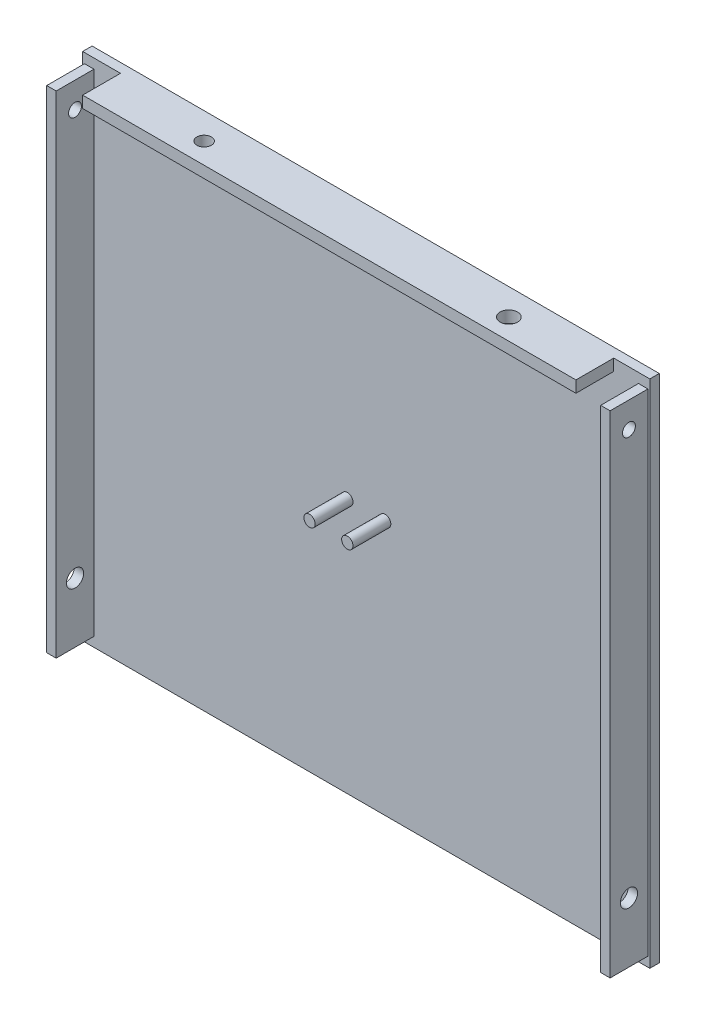
ISO-10303-21;
HEADER;
FILE_DESCRIPTION(('STEP AP214'),'2;1');
FILE_NAME('part.step','',(''),(''),'','','');
FILE_SCHEMA(('AUTOMOTIVE_DESIGN { 1 0 10303 214 1 1 1 1 }'));
ENDSEC;
DATA;
#1=APPLICATION_CONTEXT('core data for automotive mechanical design processes');
#2=APPLICATION_PROTOCOL_DEFINITION('international standard','automotive_design',2000,#1);
#3=PRODUCT_CONTEXT('',#1,'mechanical');
#4=PRODUCT('Part','Part','',(#3));
#5=PRODUCT_RELATED_PRODUCT_CATEGORY('part','',(#4));
#6=PRODUCT_DEFINITION_FORMATION('','',#4);
#7=PRODUCT_DEFINITION_CONTEXT('part definition',#1,'design');
#8=PRODUCT_DEFINITION('design','',#6,#7);
#9=PRODUCT_DEFINITION_SHAPE('','',#8);
#10=(LENGTH_UNIT() NAMED_UNIT(*) SI_UNIT(.MILLI.,.METRE.));
#11=(NAMED_UNIT(*) PLANE_ANGLE_UNIT() SI_UNIT($,.RADIAN.));
#12=(NAMED_UNIT(*) SI_UNIT($,.STERADIAN.) SOLID_ANGLE_UNIT());
#13=UNCERTAINTY_MEASURE_WITH_UNIT(LENGTH_MEASURE(1.E-05),#10,'distance_accuracy_value','');
#14=(GEOMETRIC_REPRESENTATION_CONTEXT(3) GLOBAL_UNCERTAINTY_ASSIGNED_CONTEXT((#13)) GLOBAL_UNIT_ASSIGNED_CONTEXT((#10,
#11,#12)) REPRESENTATION_CONTEXT('',''));
#15=CARTESIAN_POINT('',(0.,0.,0.));
#16=DIRECTION('',(0.,0.,1.));
#17=DIRECTION('',(1.,0.,0.));
#18=AXIS2_PLACEMENT_3D('',#15,#16,#17);
#19=CARTESIAN_POINT('',(0.,0.,5.));
#20=DIRECTION('',(0.,0.,1.));
#21=DIRECTION('',(1.,0.,0.));
#22=AXIS2_PLACEMENT_3D('',#19,#20,#21);
#23=PLANE('',#22);
#24=CARTESIAN_POINT('',(10.,0.,5.));
#25=DIRECTION('',(0.,0.,1.));
#26=DIRECTION('',(1.,0.,0.));
#27=AXIS2_PLACEMENT_3D('',#24,#25,#26);
#28=CIRCLE('',#27,3.);
#29=CARTESIAN_POINT('',(13.,0.,5.));
#30=VERTEX_POINT('',#29);
#31=EDGE_CURVE('E270',#30,#30,#28,.T.);
#32=ORIENTED_EDGE('',*,*,#31,.F.);
#33=EDGE_LOOP('',(#32));
#34=FACE_BOUND('',#33,.T.);
#35=CARTESIAN_POINT('',(-10.,0.,5.));
#36=DIRECTION('',(0.,0.,1.));
#37=DIRECTION('',(1.,0.,0.));
#38=AXIS2_PLACEMENT_3D('',#35,#36,#37);
#39=CIRCLE('',#38,3.);
#40=CARTESIAN_POINT('',(-7.,0.,5.));
#41=VERTEX_POINT('',#40);
#42=EDGE_CURVE('E286',#41,#41,#39,.T.);
#43=ORIENTED_EDGE('',*,*,#42,.F.);
#44=EDGE_LOOP('',(#43));
#45=FACE_BOUND('',#44,.T.);
#46=DIRECTION('',(1.,0.,0.));
#47=VECTOR('',#46,1.);
#48=CARTESIAN_POINT('',(-149.,-129.928999447417,5.));
#49=LINE('',#48,#47);
#50=CARTESIAN_POINT('',(-149.,-129.928999447417,5.));
#51=VERTEX_POINT('',#50);
#52=CARTESIAN_POINT('',(-144.,-129.928999447417,5.));
#53=VERTEX_POINT('',#52);
#54=EDGE_CURVE('E217',#51,#53,#49,.T.);
#55=ORIENTED_EDGE('',*,*,#54,.F.);
#56=DIRECTION('',(0.,-1.,0.));
#57=VECTOR('',#56,1.);
#58=CARTESIAN_POINT('',(-149.,129.897621204129,5.));
#59=LINE('',#58,#57);
#60=CARTESIAN_POINT('',(-149.,129.897621204129,5.));
#61=VERTEX_POINT('',#60);
#62=EDGE_CURVE('E203',#61,#51,#59,.T.);
#63=ORIENTED_EDGE('',*,*,#62,.F.);
#64=DIRECTION('',(-1.,0.,0.));
#65=VECTOR('',#64,1.);
#66=CARTESIAN_POINT('',(-149.,129.897621204129,5.));
#67=LINE('',#66,#65);
#68=CARTESIAN_POINT('',(-144.,129.897621204129,5.));
#69=VERTEX_POINT('',#68);
#70=EDGE_CURVE('E208',#69,#61,#67,.T.);
#71=ORIENTED_EDGE('',*,*,#70,.F.);
#72=DIRECTION('',(0.,1.,0.));
#73=VECTOR('',#72,1.);
#74=CARTESIAN_POINT('',(-144.,129.897621204129,5.));
#75=LINE('',#74,#73);
#76=EDGE_CURVE('E219',#53,#69,#75,.T.);
#77=ORIENTED_EDGE('',*,*,#76,.F.);
#78=EDGE_LOOP('',(#55,#63,#71,#77));
#79=FACE_BOUND('',#78,.T.);
#80=DIRECTION('',(-1.,0.,0.));
#81=VECTOR('',#80,1.);
#82=CARTESIAN_POINT('',(149.,129.897621204129,5.));
#83=LINE('',#82,#81);
#84=CARTESIAN_POINT('',(149.,129.897621204129,5.));
#85=VERTEX_POINT('',#84);
#86=CARTESIAN_POINT('',(144.,129.897621204129,5.));
#87=VERTEX_POINT('',#86);
#88=EDGE_CURVE('E172',#85,#87,#83,.T.);
#89=ORIENTED_EDGE('',*,*,#88,.F.);
#90=DIRECTION('',(0.,1.,0.));
#91=VECTOR('',#90,1.);
#92=CARTESIAN_POINT('',(149.,129.897621204129,5.));
#93=LINE('',#92,#91);
#94=CARTESIAN_POINT('',(149.,-129.928999447417,5.));
#95=VERTEX_POINT('',#94);
#96=EDGE_CURVE('E169',#95,#85,#93,.T.);
#97=ORIENTED_EDGE('',*,*,#96,.F.);
#98=DIRECTION('',(1.,0.,0.));
#99=VECTOR('',#98,1.);
#100=CARTESIAN_POINT('',(149.,-129.928999447417,5.));
#101=LINE('',#100,#99);
#102=CARTESIAN_POINT('',(144.,-129.928999447417,5.));
#103=VERTEX_POINT('',#102);
#104=EDGE_CURVE('E182',#103,#95,#101,.T.);
#105=ORIENTED_EDGE('',*,*,#104,.F.);
#106=DIRECTION('',(0.,-1.,0.));
#107=VECTOR('',#106,1.);
#108=CARTESIAN_POINT('',(144.,129.897621204129,5.));
#109=LINE('',#108,#107);
#110=EDGE_CURVE('E190',#87,#103,#109,.T.);
#111=ORIENTED_EDGE('',*,*,#110,.F.);
#112=EDGE_LOOP('',(#89,#97,#105,#111));
#113=FACE_BOUND('',#112,.T.);
#114=DIRECTION('',(1.,0.,0.));
#115=VECTOR('',#114,1.);
#116=CARTESIAN_POINT('',(-129.982734615215,128.884089216855,5.));
#117=LINE('',#116,#115);
#118=CARTESIAN_POINT('',(-129.982734615215,128.884089216855,5.));
#119=VERTEX_POINT('',#118);
#120=CARTESIAN_POINT('',(130.910278218543,128.884089216855,5.));
#121=VERTEX_POINT('',#120);
#122=EDGE_CURVE('E50',#119,#121,#117,.T.);
#123=ORIENTED_EDGE('',*,*,#122,.F.);
#124=DIRECTION('',(0.,-1.,0.));
#125=VECTOR('',#124,1.);
#126=CARTESIAN_POINT('',(-129.982734615215,135.,5.));
#127=LINE('',#126,#125);
#128=CARTESIAN_POINT('',(-129.982734615215,135.,5.));
#129=VERTEX_POINT('',#128);
#130=EDGE_CURVE('E168',#129,#119,#127,.T.);
#131=ORIENTED_EDGE('',*,*,#130,.F.);
#132=DIRECTION('',(-1.,0.,0.));
#133=VECTOR('',#132,1.);
#134=CARTESIAN_POINT('',(150.,135.,5.));
#135=LINE('',#134,#133);
#136=CARTESIAN_POINT('',(-150.,135.,5.));
#137=VERTEX_POINT('',#136);
#138=EDGE_CURVE('E241',#129,#137,#135,.T.);
#139=ORIENTED_EDGE('',*,*,#138,.T.);
#140=DIRECTION('',(0.,-1.,0.));
#141=VECTOR('',#140,1.);
#142=CARTESIAN_POINT('',(-150.,-135.,5.));
#143=LINE('',#142,#141);
#144=CARTESIAN_POINT('',(-150.,-135.,5.));
#145=VERTEX_POINT('',#144);
#146=EDGE_CURVE('E233',#137,#145,#143,.T.);
#147=ORIENTED_EDGE('',*,*,#146,.T.);
#148=DIRECTION('',(1.,0.,0.));
#149=VECTOR('',#148,1.);
#150=CARTESIAN_POINT('',(150.,-135.,5.));
#151=LINE('',#150,#149);
#152=CARTESIAN_POINT('',(150.,-135.,5.));
#153=VERTEX_POINT('',#152);
#154=EDGE_CURVE('E236',#145,#153,#151,.T.);
#155=ORIENTED_EDGE('',*,*,#154,.T.);
#156=DIRECTION('',(0.,1.,0.));
#157=VECTOR('',#156,1.);
#158=CARTESIAN_POINT('',(150.,-135.,5.));
#159=LINE('',#158,#157);
#160=CARTESIAN_POINT('',(150.,135.,5.));
#161=VERTEX_POINT('',#160);
#162=EDGE_CURVE('E239',#153,#161,#159,.T.);
#163=ORIENTED_EDGE('',*,*,#162,.T.);
#164=CARTESIAN_POINT('',(130.910278218543,135.,5.));
#165=VERTEX_POINT('',#164);
#166=EDGE_CURVE('E242',#161,#165,#135,.T.);
#167=ORIENTED_EDGE('',*,*,#166,.T.);
#168=DIRECTION('',(0.,1.,0.));
#169=VECTOR('',#168,1.);
#170=CARTESIAN_POINT('',(130.910278218543,135.,5.));
#171=LINE('',#170,#169);
#172=EDGE_CURVE('E55',#121,#165,#171,.T.);
#173=ORIENTED_EDGE('',*,*,#172,.F.);
#174=EDGE_LOOP('',(#123,#131,#139,#147,#155,#163,#167,#173));
#175=FACE_BOUND('',#174,.T.);
#176=ADVANCED_FACE('F33',(#34,#45,#79,#113,#175),#23,.T.);
#177=CARTESIAN_POINT('',(-150.,-135.,5.));
#178=DIRECTION('',(1.,0.,0.));
#179=DIRECTION('',(0.,0.,-1.));
#180=AXIS2_PLACEMENT_3D('',#177,#178,#179);
#181=PLANE('',#180);
#182=DIRECTION('',(0.,-1.,0.));
#183=VECTOR('',#182,1.);
#184=CARTESIAN_POINT('',(-150.,-135.,0.));
#185=LINE('',#184,#183);
#186=CARTESIAN_POINT('',(-150.,135.,0.));
#187=VERTEX_POINT('',#186);
#188=CARTESIAN_POINT('',(-150.,-135.,0.));
#189=VERTEX_POINT('',#188);
#190=EDGE_CURVE('E232',#187,#189,#185,.T.);
#191=ORIENTED_EDGE('',*,*,#190,.T.);
#192=DIRECTION('',(0.,0.,-1.));
#193=VECTOR('',#192,1.);
#194=CARTESIAN_POINT('',(-150.,-135.,5.));
#195=LINE('',#194,#193);
#196=EDGE_CURVE('E11',#145,#189,#195,.T.);
#197=ORIENTED_EDGE('',*,*,#196,.F.);
#198=ORIENTED_EDGE('',*,*,#146,.F.);
#199=DIRECTION('',(0.,0.,-1.));
#200=VECTOR('',#199,1.);
#201=CARTESIAN_POINT('',(-150.,135.,5.));
#202=LINE('',#201,#200);
#203=EDGE_CURVE('E244',#137,#187,#202,.T.);
#204=ORIENTED_EDGE('',*,*,#203,.T.);
#205=EDGE_LOOP('',(#191,#197,#198,#204));
#206=FACE_BOUND('',#205,.T.);
#207=ADVANCED_FACE('F35',(#206),#181,.F.);
#208=CARTESIAN_POINT('',(150.,-135.,5.));
#209=DIRECTION('',(0.,1.,0.));
#210=DIRECTION('',(-1.,0.,0.));
#211=AXIS2_PLACEMENT_3D('',#208,#209,#210);
#212=PLANE('',#211);
#213=DIRECTION('',(1.,0.,0.));
#214=VECTOR('',#213,1.);
#215=CARTESIAN_POINT('',(150.,-135.,0.));
#216=LINE('',#215,#214);
#217=CARTESIAN_POINT('',(150.,-135.,0.));
#218=VERTEX_POINT('',#217);
#219=EDGE_CURVE('E247',#189,#218,#216,.T.);
#220=ORIENTED_EDGE('',*,*,#219,.T.);
#221=DIRECTION('',(0.,0.,-1.));
#222=VECTOR('',#221,1.);
#223=CARTESIAN_POINT('',(150.,-135.,5.));
#224=LINE('',#223,#222);
#225=EDGE_CURVE('E42',#153,#218,#224,.T.);
#226=ORIENTED_EDGE('',*,*,#225,.F.);
#227=ORIENTED_EDGE('',*,*,#154,.F.);
#228=ORIENTED_EDGE('',*,*,#196,.T.);
#229=EDGE_LOOP('',(#220,#226,#227,#228));
#230=FACE_BOUND('',#229,.T.);
#231=ADVANCED_FACE('F336',(#230),#212,.F.);
#232=CARTESIAN_POINT('',(150.,-135.,5.));
#233=DIRECTION('',(-1.,0.,0.));
#234=DIRECTION('',(0.,0.,1.));
#235=AXIS2_PLACEMENT_3D('',#232,#233,#234);
#236=PLANE('',#235);
#237=DIRECTION('',(0.,1.,0.));
#238=VECTOR('',#237,1.);
#239=CARTESIAN_POINT('',(150.,-135.,0.));
#240=LINE('',#239,#238);
#241=CARTESIAN_POINT('',(150.,135.,0.));
#242=VERTEX_POINT('',#241);
#243=EDGE_CURVE('E249',#218,#242,#240,.T.);
#244=ORIENTED_EDGE('',*,*,#243,.T.);
#245=DIRECTION('',(0.,0.,-1.));
#246=VECTOR('',#245,1.);
#247=CARTESIAN_POINT('',(150.,135.,5.));
#248=LINE('',#247,#246);
#249=EDGE_CURVE('E254',#161,#242,#248,.T.);
#250=ORIENTED_EDGE('',*,*,#249,.F.);
#251=ORIENTED_EDGE('',*,*,#162,.F.);
#252=ORIENTED_EDGE('',*,*,#225,.T.);
#253=EDGE_LOOP('',(#244,#250,#251,#252));
#254=FACE_BOUND('',#253,.T.);
#255=ADVANCED_FACE('F350',(#254),#236,.F.);
#256=CARTESIAN_POINT('',(150.,135.,5.));
#257=DIRECTION('',(0.,-1.,0.));
#258=DIRECTION('',(1.,0.,0.));
#259=AXIS2_PLACEMENT_3D('',#256,#257,#258);
#260=PLANE('',#259);
#261=CARTESIAN_POINT('',(84.3762299753164,135.,13.9432588580087));
#262=DIRECTION('',(0.,1.,0.));
#263=DIRECTION('',(-1.,0.,0.));
#264=AXIS2_PLACEMENT_3D('',#261,#262,#263);
#265=CIRCLE('',#264,4.62822836412596);
#266=CARTESIAN_POINT('',(79.7480016111905,135.,13.9432588580087));
#267=VERTEX_POINT('',#266);
#268=EDGE_CURVE('E282',#267,#267,#265,.T.);
#269=ORIENTED_EDGE('',*,*,#268,.F.);
#270=EDGE_LOOP('',(#269));
#271=FACE_BOUND('',#270,.T.);
#272=CARTESIAN_POINT('',(-76.8099171193207,135.,13.9432588580087));
#273=DIRECTION('',(0.,1.,0.));
#274=DIRECTION('',(-1.,0.,0.));
#275=AXIS2_PLACEMENT_3D('',#272,#273,#274);
#276=CIRCLE('',#275,3.8417763376881);
#277=CARTESIAN_POINT('',(-80.6516934570088,135.,13.9432588580087));
#278=VERTEX_POINT('',#277);
#279=EDGE_CURVE('E271',#278,#278,#276,.T.);
#280=ORIENTED_EDGE('',*,*,#279,.F.);
#281=EDGE_LOOP('',(#280));
#282=FACE_BOUND('',#281,.T.);
#283=DIRECTION('',(-1.,0.,0.));
#284=VECTOR('',#283,1.);
#285=CARTESIAN_POINT('',(150.,135.,0.));
#286=LINE('',#285,#284);
#287=EDGE_CURVE('E237',#242,#187,#286,.T.);
#288=ORIENTED_EDGE('',*,*,#287,.T.);
#289=ORIENTED_EDGE('',*,*,#203,.F.);
#290=ORIENTED_EDGE('',*,*,#138,.F.);
#291=DIRECTION('',(0.,0.,-1.));
#292=VECTOR('',#291,1.);
#293=CARTESIAN_POINT('',(-129.982734615215,135.,25.));
#294=LINE('',#293,#292);
#295=CARTESIAN_POINT('',(-129.982734615215,135.,25.));
#296=VERTEX_POINT('',#295);
#297=EDGE_CURVE('E309',#296,#129,#294,.T.);
#298=ORIENTED_EDGE('',*,*,#297,.F.);
#299=DIRECTION('',(-1.,0.,0.));
#300=VECTOR('',#299,1.);
#301=CARTESIAN_POINT('',(-129.982734615215,135.,25.));
#302=LINE('',#301,#300);
#303=CARTESIAN_POINT('',(130.910278218543,135.,25.));
#304=VERTEX_POINT('',#303);
#305=EDGE_CURVE('E162',#304,#296,#302,.T.);
#306=ORIENTED_EDGE('',*,*,#305,.F.);
#307=DIRECTION('',(0.,0.,-1.));
#308=VECTOR('',#307,1.);
#309=CARTESIAN_POINT('',(130.910278218543,135.,25.));
#310=LINE('',#309,#308);
#311=EDGE_CURVE('E174',#304,#165,#310,.T.);
#312=ORIENTED_EDGE('',*,*,#311,.T.);
#313=ORIENTED_EDGE('',*,*,#166,.F.);
#314=ORIENTED_EDGE('',*,*,#249,.T.);
#315=EDGE_LOOP('',(#288,#289,#290,#298,#306,#312,#313,#314));
#316=FACE_BOUND('',#315,.T.);
#317=ADVANCED_FACE('F317',(#271,#282,#316),#260,.F.);
#318=CARTESIAN_POINT('',(0.,0.,0.));
#319=DIRECTION('',(0.,0.,1.));
#320=DIRECTION('',(1.,0.,0.));
#321=AXIS2_PLACEMENT_3D('',#318,#319,#320);
#322=PLANE('',#321);
#323=ORIENTED_EDGE('',*,*,#190,.F.);
#324=ORIENTED_EDGE('',*,*,#287,.F.);
#325=ORIENTED_EDGE('',*,*,#243,.F.);
#326=ORIENTED_EDGE('',*,*,#219,.F.);
#327=EDGE_LOOP('',(#323,#324,#325,#326));
#328=FACE_BOUND('',#327,.T.);
#329=ADVANCED_FACE('F344',(#328),#322,.F.);
#330=CARTESIAN_POINT('',(-149.,129.897621204129,25.));
#331=DIRECTION('',(1.,0.,0.));
#332=DIRECTION('',(0.,1.,0.));
#333=AXIS2_PLACEMENT_3D('',#330,#331,#332);
#334=PLANE('',#333);
#335=CARTESIAN_POINT('',(-149.,-98.2580416485662,15.0362442927683));
#336=DIRECTION('',(-1.,0.,0.));
#337=DIRECTION('',(0.,0.,1.));
#338=AXIS2_PLACEMENT_3D('',#335,#336,#337);
#339=CIRCLE('',#338,4.55159226057302);
#340=CARTESIAN_POINT('',(-149.,-98.2580416485662,19.5878365533413));
#341=VERTEX_POINT('',#340);
#342=EDGE_CURVE('E267',#341,#341,#339,.T.);
#343=ORIENTED_EDGE('',*,*,#342,.F.);
#344=EDGE_LOOP('',(#343));
#345=FACE_BOUND('',#344,.T.);
#346=CARTESIAN_POINT('',(-149.,116.297685092032,15.0362442927683));
#347=DIRECTION('',(-1.,0.,0.));
#348=DIRECTION('',(0.,0.,1.));
#349=AXIS2_PLACEMENT_3D('',#346,#347,#348);
#350=CIRCLE('',#349,3.41767768600162);
#351=CARTESIAN_POINT('',(-149.,116.297685092032,18.4539219787699));
#352=VERTEX_POINT('',#351);
#353=EDGE_CURVE('E263',#352,#352,#350,.T.);
#354=ORIENTED_EDGE('',*,*,#353,.F.);
#355=EDGE_LOOP('',(#354));
#356=FACE_BOUND('',#355,.T.);
#357=ORIENTED_EDGE('',*,*,#62,.T.);
#358=DIRECTION('',(0.,0.,-1.));
#359=VECTOR('',#358,1.);
#360=CARTESIAN_POINT('',(-149.,-129.928999447417,25.));
#361=LINE('',#360,#359);
#362=CARTESIAN_POINT('',(-149.,-129.928999447417,25.));
#363=VERTEX_POINT('',#362);
#364=EDGE_CURVE('E230',#363,#51,#361,.T.);
#365=ORIENTED_EDGE('',*,*,#364,.F.);
#366=DIRECTION('',(0.,-1.,0.));
#367=VECTOR('',#366,1.);
#368=CARTESIAN_POINT('',(-149.,129.897621204129,25.));
#369=LINE('',#368,#367);
#370=CARTESIAN_POINT('',(-149.,129.897621204129,25.));
#371=VERTEX_POINT('',#370);
#372=EDGE_CURVE('E204',#371,#363,#369,.T.);
#373=ORIENTED_EDGE('',*,*,#372,.F.);
#374=DIRECTION('',(0.,0.,-1.));
#375=VECTOR('',#374,1.);
#376=CARTESIAN_POINT('',(-149.,129.897621204129,25.));
#377=LINE('',#376,#375);
#378=EDGE_CURVE('E214',#371,#61,#377,.T.);
#379=ORIENTED_EDGE('',*,*,#378,.T.);
#380=EDGE_LOOP('',(#357,#365,#373,#379));
#381=FACE_BOUND('',#380,.T.);
#382=ADVANCED_FACE('F342',(#345,#356,#381),#334,.F.);
#383=CARTESIAN_POINT('',(-149.,-129.928999447417,25.));
#384=DIRECTION('',(0.,1.,0.));
#385=DIRECTION('',(0.,0.,1.));
#386=AXIS2_PLACEMENT_3D('',#383,#384,#385);
#387=PLANE('',#386);
#388=ORIENTED_EDGE('',*,*,#54,.T.);
#389=DIRECTION('',(0.,0.,-1.));
#390=VECTOR('',#389,1.);
#391=CARTESIAN_POINT('',(-144.,-129.928999447417,25.));
#392=LINE('',#391,#390);
#393=CARTESIAN_POINT('',(-144.,-129.928999447417,25.));
#394=VERTEX_POINT('',#393);
#395=EDGE_CURVE('E227',#394,#53,#392,.T.);
#396=ORIENTED_EDGE('',*,*,#395,.F.);
#397=DIRECTION('',(1.,0.,0.));
#398=VECTOR('',#397,1.);
#399=CARTESIAN_POINT('',(-149.,-129.928999447417,25.));
#400=LINE('',#399,#398);
#401=EDGE_CURVE('E207',#363,#394,#400,.T.);
#402=ORIENTED_EDGE('',*,*,#401,.F.);
#403=ORIENTED_EDGE('',*,*,#364,.T.);
#404=EDGE_LOOP('',(#388,#396,#402,#403));
#405=FACE_BOUND('',#404,.T.);
#406=ADVANCED_FACE('F390',(#405),#387,.F.);
#407=CARTESIAN_POINT('',(-144.,129.897621204129,25.));
#408=DIRECTION('',(-1.,0.,0.));
#409=DIRECTION('',(0.,-1.,0.));
#410=AXIS2_PLACEMENT_3D('',#407,#408,#409);
#411=PLANE('',#410);
#412=CARTESIAN_POINT('',(-144.,-98.2580416485662,15.0362442927683));
#413=DIRECTION('',(-1.,0.,0.));
#414=DIRECTION('',(0.,-1.,0.));
#415=AXIS2_PLACEMENT_3D('',#412,#413,#414);
#416=CIRCLE('',#415,4.55159226057302);
#417=CARTESIAN_POINT('',(-144.,-102.809633909139,15.0362442927683));
#418=VERTEX_POINT('',#417);
#419=EDGE_CURVE('E297',#418,#418,#416,.T.);
#420=ORIENTED_EDGE('',*,*,#419,.T.);
#421=EDGE_LOOP('',(#420));
#422=FACE_BOUND('',#421,.T.);
#423=CARTESIAN_POINT('',(-144.,116.297685092032,15.0362442927683));
#424=DIRECTION('',(-1.,0.,0.));
#425=DIRECTION('',(0.,-1.,0.));
#426=AXIS2_PLACEMENT_3D('',#423,#424,#425);
#427=CIRCLE('',#426,3.41767768600162);
#428=CARTESIAN_POINT('',(-144.,112.880007406031,15.0362442927683));
#429=VERTEX_POINT('',#428);
#430=EDGE_CURVE('E304',#429,#429,#427,.T.);
#431=ORIENTED_EDGE('',*,*,#430,.T.);
#432=EDGE_LOOP('',(#431));
#433=FACE_BOUND('',#432,.T.);
#434=ORIENTED_EDGE('',*,*,#76,.T.);
#435=DIRECTION('',(0.,0.,-1.));
#436=VECTOR('',#435,1.);
#437=CARTESIAN_POINT('',(-144.,129.897621204129,25.));
#438=LINE('',#437,#436);
#439=CARTESIAN_POINT('',(-144.,129.897621204129,25.));
#440=VERTEX_POINT('',#439);
#441=EDGE_CURVE('E225',#440,#69,#438,.T.);
#442=ORIENTED_EDGE('',*,*,#441,.F.);
#443=DIRECTION('',(0.,1.,0.));
#444=VECTOR('',#443,1.);
#445=CARTESIAN_POINT('',(-144.,129.897621204129,25.));
#446=LINE('',#445,#444);
#447=EDGE_CURVE('E210',#394,#440,#446,.T.);
#448=ORIENTED_EDGE('',*,*,#447,.F.);
#449=ORIENTED_EDGE('',*,*,#395,.T.);
#450=EDGE_LOOP('',(#434,#442,#448,#449));
#451=FACE_BOUND('',#450,.T.);
#452=ADVANCED_FACE('F398',(#422,#433,#451),#411,.F.);
#453=CARTESIAN_POINT('',(-149.,129.897621204129,25.));
#454=DIRECTION('',(0.,-1.,0.));
#455=DIRECTION('',(0.,0.,-1.));
#456=AXIS2_PLACEMENT_3D('',#453,#454,#455);
#457=PLANE('',#456);
#458=ORIENTED_EDGE('',*,*,#70,.T.);
#459=ORIENTED_EDGE('',*,*,#378,.F.);
#460=DIRECTION('',(-1.,0.,0.));
#461=VECTOR('',#460,1.);
#462=CARTESIAN_POINT('',(-149.,129.897621204129,25.));
#463=LINE('',#462,#461);
#464=EDGE_CURVE('E212',#440,#371,#463,.T.);
#465=ORIENTED_EDGE('',*,*,#464,.F.);
#466=ORIENTED_EDGE('',*,*,#441,.T.);
#467=EDGE_LOOP('',(#458,#459,#465,#466));
#468=FACE_BOUND('',#467,.T.);
#469=ADVANCED_FACE('F405',(#468),#457,.F.);
#470=CARTESIAN_POINT('',(0.,0.,25.));
#471=DIRECTION('',(0.,0.,1.));
#472=DIRECTION('',(1.,0.,0.));
#473=AXIS2_PLACEMENT_3D('',#470,#471,#472);
#474=PLANE('',#473);
#475=ORIENTED_EDGE('',*,*,#372,.T.);
#476=ORIENTED_EDGE('',*,*,#401,.T.);
#477=ORIENTED_EDGE('',*,*,#447,.T.);
#478=ORIENTED_EDGE('',*,*,#464,.T.);
#479=EDGE_LOOP('',(#475,#476,#477,#478));
#480=FACE_BOUND('',#479,.T.);
#481=ADVANCED_FACE('F413',(#480),#474,.T.);
#482=CARTESIAN_POINT('',(149.,129.897621204129,25.));
#483=DIRECTION('',(-1.,0.,0.));
#484=DIRECTION('',(0.,-1.,0.));
#485=AXIS2_PLACEMENT_3D('',#482,#483,#484);
#486=PLANE('',#485);
#487=CARTESIAN_POINT('',(149.,-98.2580416485662,15.0362442927683));
#488=DIRECTION('',(-1.,0.,0.));
#489=DIRECTION('',(0.,-1.,0.));
#490=AXIS2_PLACEMENT_3D('',#487,#488,#489);
#491=CIRCLE('',#490,4.55159226057302);
#492=CARTESIAN_POINT('',(149.,-102.809633909139,15.0362442927683));
#493=VERTEX_POINT('',#492);
#494=EDGE_CURVE('E266',#493,#493,#491,.T.);
#495=ORIENTED_EDGE('',*,*,#494,.T.);
#496=EDGE_LOOP('',(#495));
#497=FACE_BOUND('',#496,.T.);
#498=CARTESIAN_POINT('',(149.,116.297685092032,15.0362442927683));
#499=DIRECTION('',(-1.,0.,0.));
#500=DIRECTION('',(0.,-1.,0.));
#501=AXIS2_PLACEMENT_3D('',#498,#499,#500);
#502=CIRCLE('',#501,3.41767768600162);
#503=CARTESIAN_POINT('',(149.,112.880007406031,15.0362442927683));
#504=VERTEX_POINT('',#503);
#505=EDGE_CURVE('E262',#504,#504,#502,.T.);
#506=ORIENTED_EDGE('',*,*,#505,.T.);
#507=EDGE_LOOP('',(#506));
#508=FACE_BOUND('',#507,.T.);
#509=ORIENTED_EDGE('',*,*,#96,.T.);
#510=DIRECTION('',(0.,0.,-1.));
#511=VECTOR('',#510,1.);
#512=CARTESIAN_POINT('',(149.,129.897621204129,25.));
#513=LINE('',#512,#511);
#514=CARTESIAN_POINT('',(149.,129.897621204129,25.));
#515=VERTEX_POINT('',#514);
#516=EDGE_CURVE('E201',#515,#85,#513,.T.);
#517=ORIENTED_EDGE('',*,*,#516,.F.);
#518=DIRECTION('',(0.,1.,0.));
#519=VECTOR('',#518,1.);
#520=CARTESIAN_POINT('',(149.,129.897621204129,25.));
#521=LINE('',#520,#519);
#522=CARTESIAN_POINT('',(149.,-129.928999447417,25.));
#523=VERTEX_POINT('',#522);
#524=EDGE_CURVE('E178',#523,#515,#521,.T.);
#525=ORIENTED_EDGE('',*,*,#524,.F.);
#526=DIRECTION('',(0.,0.,-1.));
#527=VECTOR('',#526,1.);
#528=CARTESIAN_POINT('',(149.,-129.928999447417,25.));
#529=LINE('',#528,#527);
#530=EDGE_CURVE('E187',#523,#95,#529,.T.);
#531=ORIENTED_EDGE('',*,*,#530,.T.);
#532=EDGE_LOOP('',(#509,#517,#525,#531));
#533=FACE_BOUND('',#532,.T.);
#534=ADVANCED_FACE('F421',(#497,#508,#533),#486,.F.);
#535=CARTESIAN_POINT('',(149.,129.897621204129,25.));
#536=DIRECTION('',(0.,-1.,0.));
#537=DIRECTION('',(0.,0.,-1.));
#538=AXIS2_PLACEMENT_3D('',#535,#536,#537);
#539=PLANE('',#538);
#540=ORIENTED_EDGE('',*,*,#88,.T.);
#541=DIRECTION('',(0.,0.,-1.));
#542=VECTOR('',#541,1.);
#543=CARTESIAN_POINT('',(144.,129.897621204129,25.));
#544=LINE('',#543,#542);
#545=CARTESIAN_POINT('',(144.,129.897621204129,25.));
#546=VERTEX_POINT('',#545);
#547=EDGE_CURVE('E198',#546,#87,#544,.T.);
#548=ORIENTED_EDGE('',*,*,#547,.F.);
#549=DIRECTION('',(-1.,0.,0.));
#550=VECTOR('',#549,1.);
#551=CARTESIAN_POINT('',(149.,129.897621204129,25.));
#552=LINE('',#551,#550);
#553=EDGE_CURVE('E181',#515,#546,#552,.T.);
#554=ORIENTED_EDGE('',*,*,#553,.F.);
#555=ORIENTED_EDGE('',*,*,#516,.T.);
#556=EDGE_LOOP('',(#540,#548,#554,#555));
#557=FACE_BOUND('',#556,.T.);
#558=ADVANCED_FACE('F429',(#557),#539,.F.);
#559=CARTESIAN_POINT('',(144.,129.897621204129,25.));
#560=DIRECTION('',(1.,0.,0.));
#561=DIRECTION('',(0.,1.,0.));
#562=AXIS2_PLACEMENT_3D('',#559,#560,#561);
#563=PLANE('',#562);
#564=CARTESIAN_POINT('',(144.,-98.2580416485662,15.0362442927683));
#565=DIRECTION('',(1.,0.,0.));
#566=DIRECTION('',(0.,1.,0.));
#567=AXIS2_PLACEMENT_3D('',#564,#565,#566);
#568=CIRCLE('',#567,4.55159226057302);
#569=CARTESIAN_POINT('',(144.,-93.7064493879932,15.0362442927683));
#570=VERTEX_POINT('',#569);
#571=EDGE_CURVE('E264',#570,#570,#568,.T.);
#572=ORIENTED_EDGE('',*,*,#571,.T.);
#573=EDGE_LOOP('',(#572));
#574=FACE_BOUND('',#573,.T.);
#575=CARTESIAN_POINT('',(144.,116.297685092032,15.0362442927683));
#576=DIRECTION('',(1.,0.,0.));
#577=DIRECTION('',(0.,1.,0.));
#578=AXIS2_PLACEMENT_3D('',#575,#576,#577);
#579=CIRCLE('',#578,3.41767768600162);
#580=CARTESIAN_POINT('',(144.,119.715362778034,15.0362442927683));
#581=VERTEX_POINT('',#580);
#582=EDGE_CURVE('E259',#581,#581,#579,.T.);
#583=ORIENTED_EDGE('',*,*,#582,.T.);
#584=EDGE_LOOP('',(#583));
#585=FACE_BOUND('',#584,.T.);
#586=ORIENTED_EDGE('',*,*,#110,.T.);
#587=DIRECTION('',(0.,0.,-1.));
#588=VECTOR('',#587,1.);
#589=CARTESIAN_POINT('',(144.,-129.928999447417,25.));
#590=LINE('',#589,#588);
#591=CARTESIAN_POINT('',(144.,-129.928999447417,25.));
#592=VERTEX_POINT('',#591);
#593=EDGE_CURVE('E196',#592,#103,#590,.T.);
#594=ORIENTED_EDGE('',*,*,#593,.F.);
#595=DIRECTION('',(0.,-1.,0.));
#596=VECTOR('',#595,1.);
#597=CARTESIAN_POINT('',(144.,129.897621204129,25.));
#598=LINE('',#597,#596);
#599=EDGE_CURVE('E184',#546,#592,#598,.T.);
#600=ORIENTED_EDGE('',*,*,#599,.F.);
#601=ORIENTED_EDGE('',*,*,#547,.T.);
#602=EDGE_LOOP('',(#586,#594,#600,#601));
#603=FACE_BOUND('',#602,.T.);
#604=ADVANCED_FACE('F437',(#574,#585,#603),#563,.F.);
#605=CARTESIAN_POINT('',(149.,-129.928999447417,25.));
#606=DIRECTION('',(0.,1.,0.));
#607=DIRECTION('',(0.,0.,1.));
#608=AXIS2_PLACEMENT_3D('',#605,#606,#607);
#609=PLANE('',#608);
#610=ORIENTED_EDGE('',*,*,#104,.T.);
#611=ORIENTED_EDGE('',*,*,#530,.F.);
#612=DIRECTION('',(1.,0.,0.));
#613=VECTOR('',#612,1.);
#614=CARTESIAN_POINT('',(149.,-129.928999447417,25.));
#615=LINE('',#614,#613);
#616=EDGE_CURVE('E186',#592,#523,#615,.T.);
#617=ORIENTED_EDGE('',*,*,#616,.F.);
#618=ORIENTED_EDGE('',*,*,#593,.T.);
#619=EDGE_LOOP('',(#610,#611,#617,#618));
#620=FACE_BOUND('',#619,.T.);
#621=ADVANCED_FACE('F445',(#620),#609,.F.);
#622=CARTESIAN_POINT('',(0.,0.,25.));
#623=DIRECTION('',(0.,0.,-1.));
#624=DIRECTION('',(-1.,0.,0.));
#625=AXIS2_PLACEMENT_3D('',#622,#623,#624);
#626=PLANE('',#625);
#627=ORIENTED_EDGE('',*,*,#524,.T.);
#628=ORIENTED_EDGE('',*,*,#553,.T.);
#629=ORIENTED_EDGE('',*,*,#599,.T.);
#630=ORIENTED_EDGE('',*,*,#616,.T.);
#631=EDGE_LOOP('',(#627,#628,#629,#630));
#632=FACE_BOUND('',#631,.T.);
#633=ADVANCED_FACE('F453',(#632),#626,.F.);
#634=CARTESIAN_POINT('',(-129.982734615215,135.,25.));
#635=DIRECTION('',(1.,0.,0.));
#636=DIRECTION('',(0.,0.,-1.));
#637=AXIS2_PLACEMENT_3D('',#634,#635,#636);
#638=PLANE('',#637);
#639=ORIENTED_EDGE('',*,*,#130,.T.);
#640=DIRECTION('',(0.,0.,-1.));
#641=VECTOR('',#640,1.);
#642=CARTESIAN_POINT('',(-129.982734615215,128.884089216855,25.));
#643=LINE('',#642,#641);
#644=CARTESIAN_POINT('',(-129.982734615215,128.884089216855,25.));
#645=VERTEX_POINT('',#644);
#646=EDGE_CURVE('E150',#645,#119,#643,.T.);
#647=ORIENTED_EDGE('',*,*,#646,.F.);
#648=DIRECTION('',(0.,-1.,0.));
#649=VECTOR('',#648,1.);
#650=CARTESIAN_POINT('',(-129.982734615215,135.,25.));
#651=LINE('',#650,#649);
#652=EDGE_CURVE('E157',#296,#645,#651,.T.);
#653=ORIENTED_EDGE('',*,*,#652,.F.);
#654=ORIENTED_EDGE('',*,*,#297,.T.);
#655=EDGE_LOOP('',(#639,#647,#653,#654));
#656=FACE_BOUND('',#655,.T.);
#657=ADVANCED_FACE('F167',(#656),#638,.F.);
#658=CARTESIAN_POINT('',(-129.982734615215,128.884089216855,25.));
#659=DIRECTION('',(0.,1.,0.));
#660=DIRECTION('',(0.,0.,1.));
#661=AXIS2_PLACEMENT_3D('',#658,#659,#660);
#662=PLANE('',#661);
#663=CARTESIAN_POINT('',(84.3762299753164,128.884089216855,13.9432588580087));
#664=DIRECTION('',(0.,1.,0.));
#665=DIRECTION('',(0.,0.,1.));
#666=AXIS2_PLACEMENT_3D('',#663,#664,#665);
#667=CIRCLE('',#666,4.62822836412596);
#668=CARTESIAN_POINT('',(84.3762299753164,128.884089216855,18.5714872221346));
#669=VERTEX_POINT('',#668);
#670=EDGE_CURVE('E37',#669,#669,#667,.T.);
#671=ORIENTED_EDGE('',*,*,#670,.T.);
#672=EDGE_LOOP('',(#671));
#673=FACE_BOUND('',#672,.T.);
#674=CARTESIAN_POINT('',(-76.8099171193207,128.884089216855,13.9432588580087));
#675=DIRECTION('',(0.,1.,0.));
#676=DIRECTION('',(0.,0.,1.));
#677=AXIS2_PLACEMENT_3D('',#674,#675,#676);
#678=CIRCLE('',#677,3.8417763376881);
#679=CARTESIAN_POINT('',(-76.8099171193207,128.884089216855,17.7850351956968));
#680=VERTEX_POINT('',#679);
#681=EDGE_CURVE('E268',#680,#680,#678,.T.);
#682=ORIENTED_EDGE('',*,*,#681,.T.);
#683=EDGE_LOOP('',(#682));
#684=FACE_BOUND('',#683,.T.);
#685=ORIENTED_EDGE('',*,*,#122,.T.);
#686=DIRECTION('',(0.,0.,-1.));
#687=VECTOR('',#686,1.);
#688=CARTESIAN_POINT('',(130.910278218543,128.884089216855,25.));
#689=LINE('',#688,#687);
#690=CARTESIAN_POINT('',(130.910278218543,128.884089216855,25.));
#691=VERTEX_POINT('',#690);
#692=EDGE_CURVE('E153',#691,#121,#689,.T.);
#693=ORIENTED_EDGE('',*,*,#692,.F.);
#694=DIRECTION('',(1.,0.,0.));
#695=VECTOR('',#694,1.);
#696=CARTESIAN_POINT('',(-129.982734615215,128.884089216855,25.));
#697=LINE('',#696,#695);
#698=EDGE_CURVE('E146',#645,#691,#697,.T.);
#699=ORIENTED_EDGE('',*,*,#698,.F.);
#700=ORIENTED_EDGE('',*,*,#646,.T.);
#701=EDGE_LOOP('',(#685,#693,#699,#700));
#702=FACE_BOUND('',#701,.T.);
#703=ADVANCED_FACE('F148',(#673,#684,#702),#662,.F.);
#704=CARTESIAN_POINT('',(130.910278218543,135.,25.));
#705=DIRECTION('',(-1.,0.,0.));
#706=DIRECTION('',(0.,0.,1.));
#707=AXIS2_PLACEMENT_3D('',#704,#705,#706);
#708=PLANE('',#707);
#709=ORIENTED_EDGE('',*,*,#172,.T.);
#710=ORIENTED_EDGE('',*,*,#311,.F.);
#711=DIRECTION('',(0.,1.,0.));
#712=VECTOR('',#711,1.);
#713=CARTESIAN_POINT('',(130.910278218543,135.,25.));
#714=LINE('',#713,#712);
#715=EDGE_CURVE('E156',#691,#304,#714,.T.);
#716=ORIENTED_EDGE('',*,*,#715,.F.);
#717=ORIENTED_EDGE('',*,*,#692,.T.);
#718=EDGE_LOOP('',(#709,#710,#716,#717));
#719=FACE_BOUND('',#718,.T.);
#720=ADVANCED_FACE('F319',(#719),#708,.F.);
#721=CARTESIAN_POINT('',(0.,0.,25.));
#722=DIRECTION('',(0.,0.,1.));
#723=DIRECTION('',(1.,0.,0.));
#724=AXIS2_PLACEMENT_3D('',#721,#722,#723);
#725=PLANE('',#724);
#726=ORIENTED_EDGE('',*,*,#652,.T.);
#727=ORIENTED_EDGE('',*,*,#698,.T.);
#728=ORIENTED_EDGE('',*,*,#715,.T.);
#729=ORIENTED_EDGE('',*,*,#305,.T.);
#730=EDGE_LOOP('',(#726,#727,#728,#729));
#731=FACE_BOUND('',#730,.T.);
#732=ADVANCED_FACE('F160',(#731),#725,.T.);
#733=CARTESIAN_POINT('',(150.,116.297685092032,15.0362442927683));
#734=DIRECTION('',(-1.,0.,0.));
#735=DIRECTION('',(0.,0.,1.));
#736=AXIS2_PLACEMENT_3D('',#733,#734,#735);
#737=CYLINDRICAL_SURFACE('',#736,3.41767768600162);
#738=ORIENTED_EDGE('',*,*,#582,.F.);
#739=EDGE_LOOP('',(#738));
#740=FACE_BOUND('',#739,.T.);
#741=ORIENTED_EDGE('',*,*,#505,.F.);
#742=EDGE_LOOP('',(#741));
#743=FACE_BOUND('',#742,.T.);
#744=ADVANCED_FACE('F326',(#740,#743),#737,.F.);
#745=ORIENTED_EDGE('',*,*,#353,.T.);
#746=EDGE_LOOP('',(#745));
#747=FACE_BOUND('',#746,.T.);
#748=ORIENTED_EDGE('',*,*,#430,.F.);
#749=EDGE_LOOP('',(#748));
#750=FACE_BOUND('',#749,.T.);
#751=ADVANCED_FACE('F520',(#747,#750),#737,.F.);
#752=CARTESIAN_POINT('',(150.,-98.2580416485662,15.0362442927683));
#753=DIRECTION('',(-1.,0.,0.));
#754=DIRECTION('',(0.,0.,1.));
#755=AXIS2_PLACEMENT_3D('',#752,#753,#754);
#756=CYLINDRICAL_SURFACE('',#755,4.55159226057302);
#757=ORIENTED_EDGE('',*,*,#571,.F.);
#758=EDGE_LOOP('',(#757));
#759=FACE_BOUND('',#758,.T.);
#760=ORIENTED_EDGE('',*,*,#494,.F.);
#761=EDGE_LOOP('',(#760));
#762=FACE_BOUND('',#761,.T.);
#763=ADVANCED_FACE('F518',(#759,#762),#756,.F.);
#764=ORIENTED_EDGE('',*,*,#342,.T.);
#765=EDGE_LOOP('',(#764));
#766=FACE_BOUND('',#765,.T.);
#767=ORIENTED_EDGE('',*,*,#419,.F.);
#768=EDGE_LOOP('',(#767));
#769=FACE_BOUND('',#768,.T.);
#770=ADVANCED_FACE('F514',(#766,#769),#756,.F.);
#771=CARTESIAN_POINT('',(-10.,0.,25.));
#772=DIRECTION('',(0.,0.,-1.));
#773=DIRECTION('',(-1.,0.,0.));
#774=AXIS2_PLACEMENT_3D('',#771,#772,#773);
#775=CYLINDRICAL_SURFACE('',#774,3.);
#776=CARTESIAN_POINT('',(-10.,0.,25.));
#777=DIRECTION('',(0.,0.,1.));
#778=DIRECTION('',(1.,0.,0.));
#779=AXIS2_PLACEMENT_3D('',#776,#777,#778);
#780=CIRCLE('',#779,3.);
#781=CARTESIAN_POINT('',(-7.,0.,25.));
#782=VERTEX_POINT('',#781);
#783=EDGE_CURVE('E288',#782,#782,#780,.T.);
#784=ORIENTED_EDGE('',*,*,#783,.F.);
#785=EDGE_LOOP('',(#784));
#786=FACE_BOUND('',#785,.T.);
#787=ORIENTED_EDGE('',*,*,#42,.T.);
#788=EDGE_LOOP('',(#787));
#789=FACE_BOUND('',#788,.T.);
#790=ADVANCED_FACE('F510',(#786,#789),#775,.T.);
#791=CARTESIAN_POINT('',(-10.,0.,25.));
#792=DIRECTION('',(0.,0.,1.));
#793=DIRECTION('',(1.,0.,0.));
#794=AXIS2_PLACEMENT_3D('',#791,#792,#793);
#795=PLANE('',#794);
#796=ORIENTED_EDGE('',*,*,#783,.T.);
#797=EDGE_LOOP('',(#796));
#798=FACE_BOUND('',#797,.T.);
#799=ADVANCED_FACE('F506',(#798),#795,.T.);
#800=CARTESIAN_POINT('',(10.,0.,25.));
#801=DIRECTION('',(0.,0.,-1.));
#802=DIRECTION('',(-1.,0.,0.));
#803=AXIS2_PLACEMENT_3D('',#800,#801,#802);
#804=CYLINDRICAL_SURFACE('',#803,3.);
#805=CARTESIAN_POINT('',(10.,0.,25.));
#806=DIRECTION('',(0.,0.,1.));
#807=DIRECTION('',(1.,0.,0.));
#808=AXIS2_PLACEMENT_3D('',#805,#806,#807);
#809=CIRCLE('',#808,3.);
#810=CARTESIAN_POINT('',(13.,0.,25.));
#811=VERTEX_POINT('',#810);
#812=EDGE_CURVE('E275',#811,#811,#809,.T.);
#813=ORIENTED_EDGE('',*,*,#812,.F.);
#814=EDGE_LOOP('',(#813));
#815=FACE_BOUND('',#814,.T.);
#816=ORIENTED_EDGE('',*,*,#31,.T.);
#817=EDGE_LOOP('',(#816));
#818=FACE_BOUND('',#817,.T.);
#819=ADVANCED_FACE('F502',(#815,#818),#804,.T.);
#820=CARTESIAN_POINT('',(10.,0.,25.));
#821=DIRECTION('',(0.,0.,1.));
#822=DIRECTION('',(1.,0.,0.));
#823=AXIS2_PLACEMENT_3D('',#820,#821,#822);
#824=PLANE('',#823);
#825=ORIENTED_EDGE('',*,*,#812,.T.);
#826=EDGE_LOOP('',(#825));
#827=FACE_BOUND('',#826,.T.);
#828=ADVANCED_FACE('F483',(#827),#824,.T.);
#829=CARTESIAN_POINT('',(-76.8099171193207,115.,13.9432588580087));
#830=DIRECTION('',(0.,1.,0.));
#831=DIRECTION('',(-1.,0.,0.));
#832=AXIS2_PLACEMENT_3D('',#829,#830,#831);
#833=CYLINDRICAL_SURFACE('',#832,3.8417763376881);
#834=ORIENTED_EDGE('',*,*,#279,.T.);
#835=EDGE_LOOP('',(#834));
#836=FACE_BOUND('',#835,.T.);
#837=ORIENTED_EDGE('',*,*,#681,.F.);
#838=EDGE_LOOP('',(#837));
#839=FACE_BOUND('',#838,.T.);
#840=ADVANCED_FACE('F477',(#836,#839),#833,.F.);
#841=CARTESIAN_POINT('',(84.3762299753164,115.,13.9432588580087));
#842=DIRECTION('',(0.,1.,0.));
#843=DIRECTION('',(-1.,0.,0.));
#844=AXIS2_PLACEMENT_3D('',#841,#842,#843);
#845=CYLINDRICAL_SURFACE('',#844,4.62822836412596);
#846=ORIENTED_EDGE('',*,*,#268,.T.);
#847=EDGE_LOOP('',(#846));
#848=FACE_BOUND('',#847,.T.);
#849=ORIENTED_EDGE('',*,*,#670,.F.);
#850=EDGE_LOOP('',(#849));
#851=FACE_BOUND('',#850,.T.);
#852=ADVANCED_FACE('F482',(#848,#851),#845,.F.);
#853=CLOSED_SHELL('',(#176,#207,#231,#255,#317,#329,#382,#406,#452,#469,#481,#534,#558,#604,
#621,#633,#657,#703,#720,#732,#744,#751,#763,#770,#790,#799,#819,#828,#840,#852));
#854=MANIFOLD_SOLID_BREP('B2',#853);
#855=ADVANCED_BREP_SHAPE_REPRESENTATION('',(#18,#854),#14);
#856=SHAPE_DEFINITION_REPRESENTATION(#9,#855);
ENDSEC;
END-ISO-10303-21;
